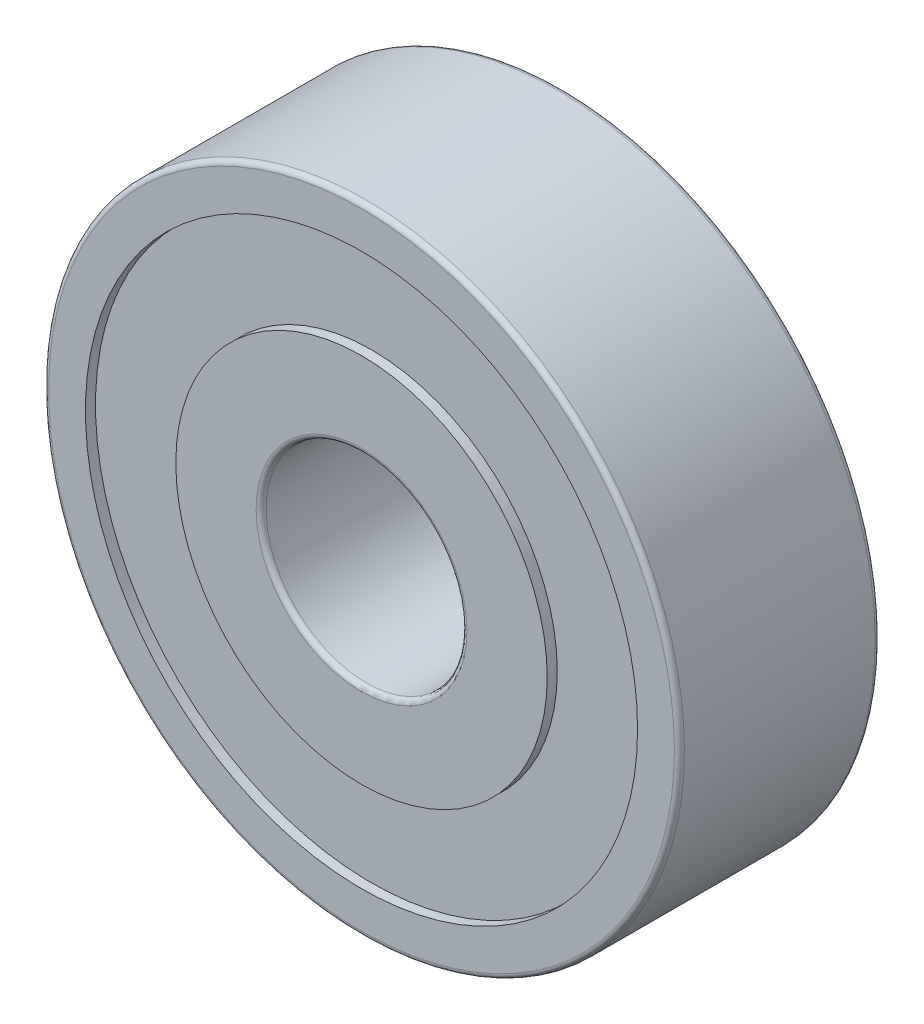
ISO-10303-21;
HEADER;
FILE_DESCRIPTION(('STEP AP214'),'2;1');
FILE_NAME('part.step','',(''),(''),'','','');
FILE_SCHEMA(('AUTOMOTIVE_DESIGN { 1 0 10303 214 1 1 1 1 }'));
ENDSEC;
DATA;
#1=APPLICATION_CONTEXT('core data for automotive mechanical design processes');
#2=APPLICATION_PROTOCOL_DEFINITION('international standard','automotive_design',2000,#1);
#3=PRODUCT_CONTEXT('',#1,'mechanical');
#4=PRODUCT('Part','Part','',(#3));
#5=PRODUCT_RELATED_PRODUCT_CATEGORY('part','',(#4));
#6=PRODUCT_DEFINITION_FORMATION('','',#4);
#7=PRODUCT_DEFINITION_CONTEXT('part definition',#1,'design');
#8=PRODUCT_DEFINITION('design','',#6,#7);
#9=PRODUCT_DEFINITION_SHAPE('','',#8);
#10=(LENGTH_UNIT() NAMED_UNIT(*) SI_UNIT(.MILLI.,.METRE.));
#11=(NAMED_UNIT(*) PLANE_ANGLE_UNIT() SI_UNIT($,.RADIAN.));
#12=(NAMED_UNIT(*) SI_UNIT($,.STERADIAN.) SOLID_ANGLE_UNIT());
#13=UNCERTAINTY_MEASURE_WITH_UNIT(LENGTH_MEASURE(1.E-05),#10,'distance_accuracy_value','');
#14=(GEOMETRIC_REPRESENTATION_CONTEXT(3) GLOBAL_UNCERTAINTY_ASSIGNED_CONTEXT((#13)) GLOBAL_UNIT_ASSIGNED_CONTEXT((#10,
#11,#12)) REPRESENTATION_CONTEXT('',''));
#15=CARTESIAN_POINT('',(0.,0.,0.));
#16=DIRECTION('',(0.,0.,1.));
#17=DIRECTION('',(1.,0.,0.));
#18=AXIS2_PLACEMENT_3D('',#15,#16,#17);
#19=CARTESIAN_POINT('',(0.,0.,0.));
#20=DIRECTION('',(0.,0.,1.));
#21=DIRECTION('',(1.,0.,0.));
#22=AXIS2_PLACEMENT_3D('',#19,#20,#21);
#23=PLANE('',#22);
#24=CARTESIAN_POINT('',(0.,0.,0.));
#25=DIRECTION('',(0.,0.,1.));
#26=DIRECTION('',(1.,0.,0.));
#27=AXIS2_PLACEMENT_3D('',#24,#25,#26);
#28=CIRCLE('',#27,3.15);
#29=CARTESIAN_POINT('',(3.15,0.,0.));
#30=VERTEX_POINT('',#29);
#31=EDGE_CURVE('E62',#30,#30,#28,.T.);
#32=ORIENTED_EDGE('',*,*,#31,.T.);
#33=EDGE_LOOP('',(#32));
#34=FACE_BOUND('',#33,.T.);
#35=CARTESIAN_POINT('',(0.,0.,0.));
#36=DIRECTION('',(0.,0.,1.));
#37=DIRECTION('',(1.,0.,0.));
#38=AXIS2_PLACEMENT_3D('',#35,#36,#37);
#39=CIRCLE('',#38,5.55);
#40=CARTESIAN_POINT('',(5.55,0.,0.));
#41=VERTEX_POINT('',#40);
#42=EDGE_CURVE('E84',#41,#41,#39,.T.);
#43=ORIENTED_EDGE('',*,*,#42,.F.);
#44=EDGE_LOOP('',(#43));
#45=FACE_BOUND('',#44,.T.);
#46=ADVANCED_FACE('F33',(#34,#45),#23,.F.);
#47=CARTESIAN_POINT('',(0.,0.,6.));
#48=DIRECTION('',(0.,0.,1.));
#49=DIRECTION('',(1.,0.,0.));
#50=AXIS2_PLACEMENT_3D('',#47,#48,#49);
#51=PLANE('',#50);
#52=CARTESIAN_POINT('',(0.,0.,6.));
#53=DIRECTION('',(0.,0.,1.));
#54=DIRECTION('',(1.,0.,0.));
#55=AXIS2_PLACEMENT_3D('',#52,#53,#54);
#56=CIRCLE('',#55,3.15);
#57=CARTESIAN_POINT('',(3.15,0.,6.));
#58=VERTEX_POINT('',#57);
#59=EDGE_CURVE('E40',#58,#58,#56,.F.);
#60=ORIENTED_EDGE('',*,*,#59,.T.);
#61=EDGE_LOOP('',(#60));
#62=FACE_BOUND('',#61,.T.);
#63=CARTESIAN_POINT('',(0.,0.,6.));
#64=DIRECTION('',(0.,0.,1.));
#65=DIRECTION('',(1.,0.,0.));
#66=AXIS2_PLACEMENT_3D('',#63,#64,#65);
#67=CIRCLE('',#66,5.55);
#68=CARTESIAN_POINT('',(5.55,0.,6.));
#69=VERTEX_POINT('',#68);
#70=EDGE_CURVE('E72',#69,#69,#67,.T.);
#71=ORIENTED_EDGE('',*,*,#70,.T.);
#72=EDGE_LOOP('',(#71));
#73=FACE_BOUND('',#72,.T.);
#74=ADVANCED_FACE('F101',(#62,#73),#51,.T.);
#75=CARTESIAN_POINT('',(0.,0.,6.));
#76=DIRECTION('',(0.,0.,1.));
#77=DIRECTION('',(1.,0.,0.));
#78=AXIS2_PLACEMENT_3D('',#75,#76,#77);
#79=CIRCLE('',#78,9.35);
#80=CARTESIAN_POINT('',(9.35,0.,6.));
#81=VERTEX_POINT('',#80);
#82=EDGE_CURVE('E10',#81,#81,#79,.T.);
#83=ORIENTED_EDGE('',*,*,#82,.T.);
#84=EDGE_LOOP('',(#83));
#85=FACE_BOUND('',#84,.T.);
#86=CARTESIAN_POINT('',(0.,0.,6.));
#87=DIRECTION('',(0.,0.,1.));
#88=DIRECTION('',(1.,0.,0.));
#89=AXIS2_PLACEMENT_3D('',#86,#87,#88);
#90=CIRCLE('',#89,8.25);
#91=CARTESIAN_POINT('',(8.25,0.,6.));
#92=VERTEX_POINT('',#91);
#93=EDGE_CURVE('E66',#92,#92,#90,.T.);
#94=ORIENTED_EDGE('',*,*,#93,.F.);
#95=EDGE_LOOP('',(#94));
#96=FACE_BOUND('',#95,.T.);
#97=ADVANCED_FACE('F108',(#85,#96),#51,.T.);
#98=CARTESIAN_POINT('',(0.,0.,0.));
#99=DIRECTION('',(0.,0.,1.));
#100=DIRECTION('',(1.,0.,0.));
#101=AXIS2_PLACEMENT_3D('',#98,#99,#100);
#102=CIRCLE('',#101,9.35);
#103=CARTESIAN_POINT('',(9.35,0.,0.));
#104=VERTEX_POINT('',#103);
#105=EDGE_CURVE('E44',#104,#104,#102,.F.);
#106=ORIENTED_EDGE('',*,*,#105,.T.);
#107=EDGE_LOOP('',(#106));
#108=FACE_BOUND('',#107,.T.);
#109=CARTESIAN_POINT('',(0.,0.,0.));
#110=DIRECTION('',(0.,0.,1.));
#111=DIRECTION('',(1.,0.,0.));
#112=AXIS2_PLACEMENT_3D('',#109,#110,#111);
#113=CIRCLE('',#112,8.25);
#114=CARTESIAN_POINT('',(8.25,0.,0.));
#115=VERTEX_POINT('',#114);
#116=EDGE_CURVE('E78',#115,#115,#113,.T.);
#117=ORIENTED_EDGE('',*,*,#116,.T.);
#118=EDGE_LOOP('',(#117));
#119=FACE_BOUND('',#118,.T.);
#120=ADVANCED_FACE('F104',(#108,#119),#23,.F.);
#121=CARTESIAN_POINT('',(0.,0.,6.));
#122=DIRECTION('',(0.,0.,-1.));
#123=DIRECTION('',(-1.,0.,0.));
#124=AXIS2_PLACEMENT_3D('',#121,#122,#123);
#125=CYLINDRICAL_SURFACE('',#124,9.5);
#126=CARTESIAN_POINT('',(0.,0.,0.15));
#127=DIRECTION('',(0.,0.,1.));
#128=DIRECTION('',(1.,0.,0.));
#129=AXIS2_PLACEMENT_3D('',#126,#127,#128);
#130=CIRCLE('',#129,9.5);
#131=CARTESIAN_POINT('',(9.5,0.,0.15));
#132=VERTEX_POINT('',#131);
#133=EDGE_CURVE('E48',#132,#132,#130,.T.);
#134=ORIENTED_EDGE('',*,*,#133,.T.);
#135=EDGE_LOOP('',(#134));
#136=FACE_BOUND('',#135,.T.);
#137=CARTESIAN_POINT('',(0.,0.,5.85));
#138=DIRECTION('',(0.,0.,1.));
#139=DIRECTION('',(1.,0.,0.));
#140=AXIS2_PLACEMENT_3D('',#137,#138,#139);
#141=CIRCLE('',#140,9.5);
#142=CARTESIAN_POINT('',(9.5,0.,5.85));
#143=VERTEX_POINT('',#142);
#144=EDGE_CURVE('E53',#143,#143,#141,.F.);
#145=ORIENTED_EDGE('',*,*,#144,.T.);
#146=EDGE_LOOP('',(#145));
#147=FACE_BOUND('',#146,.T.);
#148=ADVANCED_FACE('F112',(#136,#147),#125,.T.);
#149=CARTESIAN_POINT('',(0.,0.,6.));
#150=DIRECTION('',(0.,0.,-1.));
#151=DIRECTION('',(-1.,0.,0.));
#152=AXIS2_PLACEMENT_3D('',#149,#150,#151);
#153=CYLINDRICAL_SURFACE('',#152,3.);
#154=CARTESIAN_POINT('',(0.,0.,0.15));
#155=DIRECTION('',(0.,0.,1.));
#156=DIRECTION('',(1.,0.,0.));
#157=AXIS2_PLACEMENT_3D('',#154,#155,#156);
#158=CIRCLE('',#157,3.);
#159=CARTESIAN_POINT('',(3.,0.,0.15));
#160=VERTEX_POINT('',#159);
#161=EDGE_CURVE('E56',#160,#160,#158,.F.);
#162=ORIENTED_EDGE('',*,*,#161,.T.);
#163=EDGE_LOOP('',(#162));
#164=FACE_BOUND('',#163,.T.);
#165=CARTESIAN_POINT('',(0.,0.,5.85));
#166=DIRECTION('',(0.,0.,1.));
#167=DIRECTION('',(1.,0.,0.));
#168=AXIS2_PLACEMENT_3D('',#165,#166,#167);
#169=CIRCLE('',#168,3.);
#170=CARTESIAN_POINT('',(3.,0.,5.85));
#171=VERTEX_POINT('',#170);
#172=EDGE_CURVE('E59',#171,#171,#169,.T.);
#173=ORIENTED_EDGE('',*,*,#172,.T.);
#174=EDGE_LOOP('',(#173));
#175=FACE_BOUND('',#174,.T.);
#176=ADVANCED_FACE('F118',(#164,#175),#153,.F.);
#177=CARTESIAN_POINT('',(0.,0.,5.7));
#178=DIRECTION('',(0.,0.,1.));
#179=DIRECTION('',(1.,0.,0.));
#180=AXIS2_PLACEMENT_3D('',#177,#178,#179);
#181=CYLINDRICAL_SURFACE('',#180,8.25);
#182=CARTESIAN_POINT('',(0.,0.,5.7));
#183=DIRECTION('',(0.,0.,1.));
#184=DIRECTION('',(1.,0.,0.));
#185=AXIS2_PLACEMENT_3D('',#182,#183,#184);
#186=CIRCLE('',#185,8.25);
#187=CARTESIAN_POINT('',(8.25,0.,5.7));
#188=VERTEX_POINT('',#187);
#189=EDGE_CURVE('E65',#188,#188,#186,.T.);
#190=ORIENTED_EDGE('',*,*,#189,.F.);
#191=EDGE_LOOP('',(#190));
#192=FACE_BOUND('',#191,.T.);
#193=ORIENTED_EDGE('',*,*,#93,.T.);
#194=EDGE_LOOP('',(#193));
#195=FACE_BOUND('',#194,.T.);
#196=ADVANCED_FACE('F140',(#192,#195),#181,.F.);
#197=CARTESIAN_POINT('',(0.,0.,5.7));
#198=DIRECTION('',(0.,0.,1.));
#199=DIRECTION('',(1.,0.,0.));
#200=AXIS2_PLACEMENT_3D('',#197,#198,#199);
#201=PLANE('',#200);
#202=CARTESIAN_POINT('',(0.,0.,5.7));
#203=DIRECTION('',(0.,0.,1.));
#204=DIRECTION('',(1.,0.,0.));
#205=AXIS2_PLACEMENT_3D('',#202,#203,#204);
#206=CIRCLE('',#205,5.55);
#207=CARTESIAN_POINT('',(5.55,0.,5.7));
#208=VERTEX_POINT('',#207);
#209=EDGE_CURVE('E69',#208,#208,#206,.T.);
#210=ORIENTED_EDGE('',*,*,#209,.F.);
#211=EDGE_LOOP('',(#210));
#212=FACE_BOUND('',#211,.T.);
#213=ORIENTED_EDGE('',*,*,#189,.T.);
#214=EDGE_LOOP('',(#213));
#215=FACE_BOUND('',#214,.T.);
#216=ADVANCED_FACE('F136',(#212,#215),#201,.T.);
#217=CARTESIAN_POINT('',(0.,0.,5.7));
#218=DIRECTION('',(0.,0.,1.));
#219=DIRECTION('',(1.,0.,0.));
#220=AXIS2_PLACEMENT_3D('',#217,#218,#219);
#221=CYLINDRICAL_SURFACE('',#220,5.55);
#222=ORIENTED_EDGE('',*,*,#209,.T.);
#223=EDGE_LOOP('',(#222));
#224=FACE_BOUND('',#223,.T.);
#225=ORIENTED_EDGE('',*,*,#70,.F.);
#226=EDGE_LOOP('',(#225));
#227=FACE_BOUND('',#226,.T.);
#228=ADVANCED_FACE('F130',(#224,#227),#221,.T.);
#229=CARTESIAN_POINT('',(0.,0.,0.5));
#230=DIRECTION('',(0.,0.,1.));
#231=DIRECTION('',(1.,0.,0.));
#232=AXIS2_PLACEMENT_3D('',#229,#230,#231);
#233=PLANE('',#232);
#234=CARTESIAN_POINT('',(0.,0.,0.5));
#235=DIRECTION('',(0.,0.,1.));
#236=DIRECTION('',(1.,0.,0.));
#237=AXIS2_PLACEMENT_3D('',#234,#235,#236);
#238=CIRCLE('',#237,8.25);
#239=CARTESIAN_POINT('',(8.25,0.,0.5));
#240=VERTEX_POINT('',#239);
#241=EDGE_CURVE('E75',#240,#240,#238,.T.);
#242=ORIENTED_EDGE('',*,*,#241,.F.);
#243=EDGE_LOOP('',(#242));
#244=FACE_BOUND('',#243,.T.);
#245=CARTESIAN_POINT('',(0.,0.,0.5));
#246=DIRECTION('',(0.,0.,1.));
#247=DIRECTION('',(1.,0.,0.));
#248=AXIS2_PLACEMENT_3D('',#245,#246,#247);
#249=CIRCLE('',#248,5.55);
#250=CARTESIAN_POINT('',(5.55,0.,0.5));
#251=VERTEX_POINT('',#250);
#252=EDGE_CURVE('E81',#251,#251,#249,.T.);
#253=ORIENTED_EDGE('',*,*,#252,.T.);
#254=EDGE_LOOP('',(#253));
#255=FACE_BOUND('',#254,.T.);
#256=ADVANCED_FACE('F90',(#244,#255),#233,.F.);
#257=CARTESIAN_POINT('',(0.,0.,0.5));
#258=DIRECTION('',(0.,0.,-1.));
#259=DIRECTION('',(-1.,0.,0.));
#260=AXIS2_PLACEMENT_3D('',#257,#258,#259);
#261=CYLINDRICAL_SURFACE('',#260,8.25);
#262=ORIENTED_EDGE('',*,*,#241,.T.);
#263=EDGE_LOOP('',(#262));
#264=FACE_BOUND('',#263,.T.);
#265=ORIENTED_EDGE('',*,*,#116,.F.);
#266=EDGE_LOOP('',(#265));
#267=FACE_BOUND('',#266,.T.);
#268=ADVANCED_FACE('F96',(#264,#267),#261,.F.);
#269=CARTESIAN_POINT('',(0.,0.,0.5));
#270=DIRECTION('',(0.,0.,-1.));
#271=DIRECTION('',(-1.,0.,0.));
#272=AXIS2_PLACEMENT_3D('',#269,#270,#271);
#273=CYLINDRICAL_SURFACE('',#272,5.55);
#274=ORIENTED_EDGE('',*,*,#252,.F.);
#275=EDGE_LOOP('',(#274));
#276=FACE_BOUND('',#275,.T.);
#277=ORIENTED_EDGE('',*,*,#42,.T.);
#278=EDGE_LOOP('',(#277));
#279=FACE_BOUND('',#278,.T.);
#280=ADVANCED_FACE('F92',(#276,#279),#273,.T.);
#281=CARTESIAN_POINT('',(0.,0.,0.15));
#282=DIRECTION('',(0.,0.,1.));
#283=DIRECTION('',(1.,0.,0.));
#284=AXIS2_PLACEMENT_3D('',#281,#282,#283);
#285=TOROIDAL_SURFACE('',#284,3.15,0.15);
#286=ORIENTED_EDGE('',*,*,#161,.F.);
#287=EDGE_LOOP('',(#286));
#288=FACE_BOUND('',#287,.T.);
#289=ORIENTED_EDGE('',*,*,#31,.F.);
#290=EDGE_LOOP('',(#289));
#291=FACE_BOUND('',#290,.T.);
#292=ADVANCED_FACE('F95',(#288,#291),#285,.T.);
#293=CARTESIAN_POINT('',(0.,0.,0.15));
#294=DIRECTION('',(0.,0.,1.));
#295=DIRECTION('',(1.,0.,0.));
#296=AXIS2_PLACEMENT_3D('',#293,#294,#295);
#297=TOROIDAL_SURFACE('',#296,9.35,0.15);
#298=ORIENTED_EDGE('',*,*,#105,.F.);
#299=EDGE_LOOP('',(#298));
#300=FACE_BOUND('',#299,.T.);
#301=ORIENTED_EDGE('',*,*,#133,.F.);
#302=EDGE_LOOP('',(#301));
#303=FACE_BOUND('',#302,.T.);
#304=ADVANCED_FACE('F155',(#300,#303),#297,.T.);
#305=CARTESIAN_POINT('',(0.,0.,5.85));
#306=DIRECTION('',(0.,0.,1.));
#307=DIRECTION('',(1.,0.,0.));
#308=AXIS2_PLACEMENT_3D('',#305,#306,#307);
#309=TOROIDAL_SURFACE('',#308,3.15,0.15);
#310=ORIENTED_EDGE('',*,*,#59,.F.);
#311=EDGE_LOOP('',(#310));
#312=FACE_BOUND('',#311,.T.);
#313=ORIENTED_EDGE('',*,*,#172,.F.);
#314=EDGE_LOOP('',(#313));
#315=FACE_BOUND('',#314,.T.);
#316=ADVANCED_FACE('F153',(#312,#315),#309,.T.);
#317=CARTESIAN_POINT('',(0.,0.,5.85));
#318=DIRECTION('',(0.,0.,1.));
#319=DIRECTION('',(1.,0.,0.));
#320=AXIS2_PLACEMENT_3D('',#317,#318,#319);
#321=TOROIDAL_SURFACE('',#320,9.35,0.15);
#322=ORIENTED_EDGE('',*,*,#144,.F.);
#323=EDGE_LOOP('',(#322));
#324=FACE_BOUND('',#323,.T.);
#325=ORIENTED_EDGE('',*,*,#82,.F.);
#326=EDGE_LOOP('',(#325));
#327=FACE_BOUND('',#326,.T.);
#328=ADVANCED_FACE('F35',(#324,#327),#321,.T.);
#329=CLOSED_SHELL('',(#46,#74,#97,#120,#148,#176,#196,#216,#228,#256,#268,#280,#292,#304,#316,#328));
#330=MANIFOLD_SOLID_BREP('B2',#329);
#331=ADVANCED_BREP_SHAPE_REPRESENTATION('',(#18,#330),#14);
#332=SHAPE_DEFINITION_REPRESENTATION(#9,#331);
ENDSEC;
END-ISO-10303-21;
